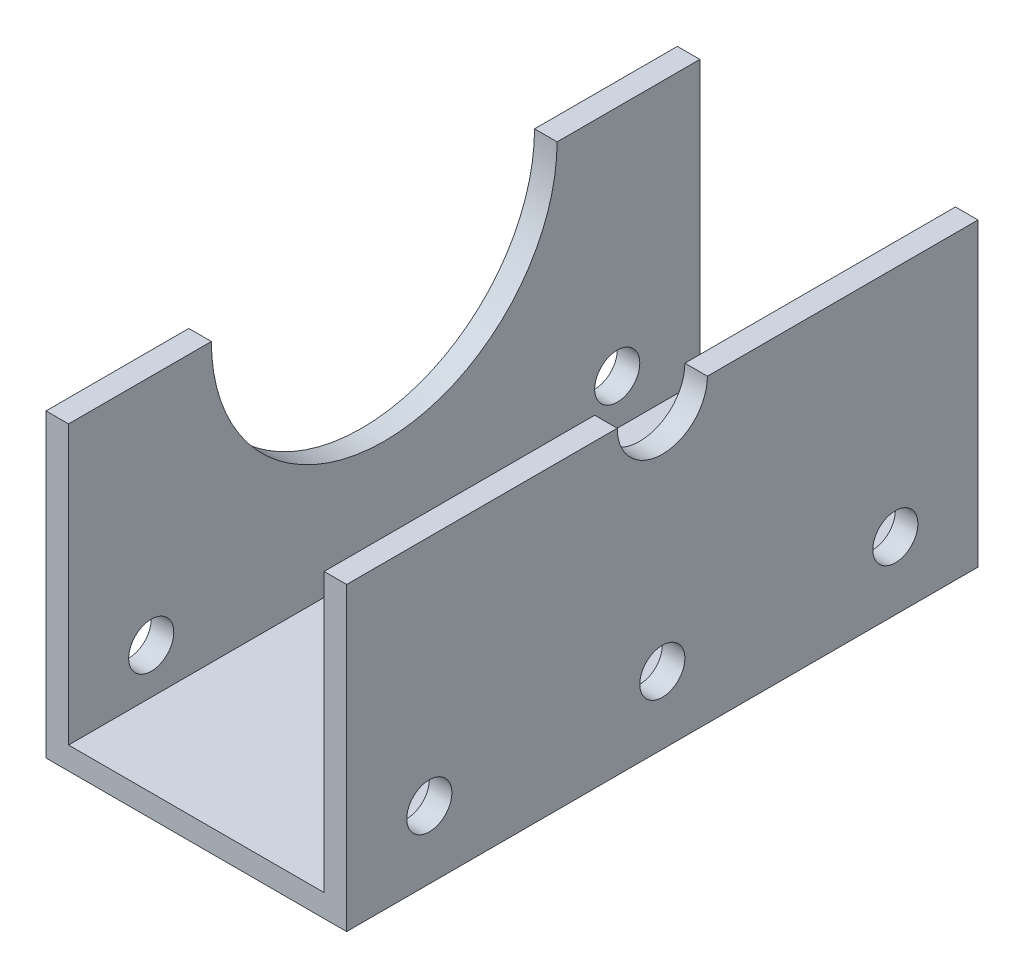
ISO-10303-21;
HEADER;
FILE_DESCRIPTION(('STEP AP214'),'2;1');
FILE_NAME('part.step','',(''),(''),'','','');
FILE_SCHEMA(('AUTOMOTIVE_DESIGN { 1 0 10303 214 1 1 1 1 }'));
ENDSEC;
DATA;
#1=APPLICATION_CONTEXT('core data for automotive mechanical design processes');
#2=APPLICATION_PROTOCOL_DEFINITION('international standard','automotive_design',2000,#1);
#3=PRODUCT_CONTEXT('',#1,'mechanical');
#4=PRODUCT('Part','Part','',(#3));
#5=PRODUCT_RELATED_PRODUCT_CATEGORY('part','',(#4));
#6=PRODUCT_DEFINITION_FORMATION('','',#4);
#7=PRODUCT_DEFINITION_CONTEXT('part definition',#1,'design');
#8=PRODUCT_DEFINITION('design','',#6,#7);
#9=PRODUCT_DEFINITION_SHAPE('','',#8);
#10=(LENGTH_UNIT() NAMED_UNIT(*) SI_UNIT(.MILLI.,.METRE.));
#11=(NAMED_UNIT(*) PLANE_ANGLE_UNIT() SI_UNIT($,.RADIAN.));
#12=(NAMED_UNIT(*) SI_UNIT($,.STERADIAN.) SOLID_ANGLE_UNIT());
#13=UNCERTAINTY_MEASURE_WITH_UNIT(LENGTH_MEASURE(1.E-05),#10,'distance_accuracy_value','');
#14=(GEOMETRIC_REPRESENTATION_CONTEXT(3) GLOBAL_UNCERTAINTY_ASSIGNED_CONTEXT((#13)) GLOBAL_UNIT_ASSIGNED_CONTEXT((#10,
#11,#12)) REPRESENTATION_CONTEXT('',''));
#15=CARTESIAN_POINT('',(0.,0.,0.));
#16=DIRECTION('',(0.,0.,1.));
#17=DIRECTION('',(1.,0.,0.));
#18=AXIS2_PLACEMENT_3D('',#15,#16,#17);
#19=CARTESIAN_POINT('',(4.38641888332215,13.1812631578947,42.));
#20=DIRECTION('',(0.,-1.,0.));
#21=DIRECTION('',(0.,0.,-1.));
#22=AXIS2_PLACEMENT_3D('',#19,#20,#21);
#23=PLANE('',#22);
#24=DIRECTION('',(0.,0.,-1.));
#25=VECTOR('',#24,1.);
#26=CARTESIAN_POINT('',(2.88641888332215,13.1812631578947,42.));
#27=LINE('',#26,#25);
#28=CARTESIAN_POINT('',(2.88641888332215,13.1812631578947,18.));
#29=VERTEX_POINT('',#28);
#30=CARTESIAN_POINT('',(2.88641888332215,13.1812631578947,0.));
#31=VERTEX_POINT('',#30);
#32=EDGE_CURVE('E130',#29,#31,#27,.T.);
#33=ORIENTED_EDGE('',*,*,#32,.F.);
#34=DIRECTION('',(1.,0.,0.));
#35=VECTOR('',#34,1.);
#36=CARTESIAN_POINT('',(-5.61358111667785,13.1812631578947,18.));
#37=LINE('',#36,#35);
#38=CARTESIAN_POINT('',(4.38641888332215,13.1812631578947,18.));
#39=VERTEX_POINT('',#38);
#40=EDGE_CURVE('E45',#29,#39,#37,.T.);
#41=ORIENTED_EDGE('',*,*,#40,.T.);
#42=DIRECTION('',(0.,0.,-1.));
#43=VECTOR('',#42,1.);
#44=CARTESIAN_POINT('',(4.38641888332215,13.1812631578947,42.));
#45=LINE('',#44,#43);
#46=CARTESIAN_POINT('',(4.38641888332215,13.1812631578947,0.));
#47=VERTEX_POINT('',#46);
#48=EDGE_CURVE('E128',#39,#47,#45,.T.);
#49=ORIENTED_EDGE('',*,*,#48,.T.);
#50=DIRECTION('',(-1.,0.,0.));
#51=VECTOR('',#50,1.);
#52=CARTESIAN_POINT('',(4.38641888332215,13.1812631578947,0.));
#53=LINE('',#52,#51);
#54=EDGE_CURVE('E202',#47,#31,#53,.T.);
#55=ORIENTED_EDGE('',*,*,#54,.T.);
#56=EDGE_LOOP('',(#33,#41,#49,#55));
#57=FACE_BOUND('',#56,.T.);
#58=ADVANCED_FACE('F30',(#57),#23,.F.);
#59=CARTESIAN_POINT('',(-14.1135811166779,13.1812631578947,42.));
#60=DIRECTION('',(0.,-1.,0.));
#61=DIRECTION('',(0.,0.,-1.));
#62=AXIS2_PLACEMENT_3D('',#59,#60,#61);
#63=PLANE('',#62);
#64=DIRECTION('',(0.,0.,-1.));
#65=VECTOR('',#64,1.);
#66=CARTESIAN_POINT('',(-14.1135811166779,13.1812631578947,42.));
#67=LINE('',#66,#65);
#68=CARTESIAN_POINT('',(-14.1135811166779,13.1812631578947,42.));
#69=VERTEX_POINT('',#68);
#70=CARTESIAN_POINT('',(-14.1135811166779,13.1812631578947,32.5));
#71=VERTEX_POINT('',#70);
#72=EDGE_CURVE('E174',#69,#71,#67,.T.);
#73=ORIENTED_EDGE('',*,*,#72,.T.);
#74=DIRECTION('',(-1.,0.,0.));
#75=VECTOR('',#74,1.);
#76=CARTESIAN_POINT('',(-5.61358111667785,13.1812631578947,32.5));
#77=LINE('',#76,#75);
#78=CARTESIAN_POINT('',(-15.6135811166778,13.1812631578947,32.5));
#79=VERTEX_POINT('',#78);
#80=EDGE_CURVE('E52',#71,#79,#77,.T.);
#81=ORIENTED_EDGE('',*,*,#80,.T.);
#82=DIRECTION('',(0.,0.,-1.));
#83=VECTOR('',#82,1.);
#84=CARTESIAN_POINT('',(-15.6135811166778,13.1812631578947,42.));
#85=LINE('',#84,#83);
#86=CARTESIAN_POINT('',(-15.6135811166778,13.1812631578947,42.));
#87=VERTEX_POINT('',#86);
#88=EDGE_CURVE('E151',#87,#79,#85,.T.);
#89=ORIENTED_EDGE('',*,*,#88,.F.);
#90=DIRECTION('',(-1.,0.,0.));
#91=VECTOR('',#90,1.);
#92=CARTESIAN_POINT('',(-14.1135811166779,13.1812631578947,42.));
#93=LINE('',#92,#91);
#94=EDGE_CURVE('E183',#69,#87,#93,.T.);
#95=ORIENTED_EDGE('',*,*,#94,.F.);
#96=EDGE_LOOP('',(#73,#81,#89,#95));
#97=FACE_BOUND('',#96,.T.);
#98=ADVANCED_FACE('F180',(#97),#63,.F.);
#99=CARTESIAN_POINT('',(-15.6135811166778,13.1812631578947,9.49999999999999));
#100=VERTEX_POINT('',#99);
#101=CARTESIAN_POINT('',(-15.6135811166778,13.1812631578947,0.));
#102=VERTEX_POINT('',#101);
#103=EDGE_CURVE('E150',#100,#102,#85,.T.);
#104=ORIENTED_EDGE('',*,*,#103,.F.);
#105=DIRECTION('',(-1.,0.,0.));
#106=VECTOR('',#105,1.);
#107=CARTESIAN_POINT('',(-5.61358111667785,13.1812631578947,9.49999999999999));
#108=LINE('',#107,#106);
#109=CARTESIAN_POINT('',(-14.1135811166779,13.1812631578947,9.49999999999999));
#110=VERTEX_POINT('',#109);
#111=EDGE_CURVE('E249',#100,#110,#108,.F.);
#112=ORIENTED_EDGE('',*,*,#111,.T.);
#113=CARTESIAN_POINT('',(-14.1135811166779,13.1812631578947,0.));
#114=VERTEX_POINT('',#113);
#115=EDGE_CURVE('E177',#110,#114,#67,.T.);
#116=ORIENTED_EDGE('',*,*,#115,.T.);
#117=DIRECTION('',(-1.,0.,0.));
#118=VECTOR('',#117,1.);
#119=CARTESIAN_POINT('',(-14.1135811166779,13.1812631578947,0.));
#120=LINE('',#119,#118);
#121=EDGE_CURVE('E216',#114,#102,#120,.T.);
#122=ORIENTED_EDGE('',*,*,#121,.T.);
#123=EDGE_LOOP('',(#104,#112,#116,#122));
#124=FACE_BOUND('',#123,.T.);
#125=ADVANCED_FACE('F32',(#124),#63,.F.);
#126=CARTESIAN_POINT('',(-15.6135811166778,13.1812631578947,42.));
#127=DIRECTION('',(1.,0.,0.));
#128=DIRECTION('',(0.,1.,0.));
#129=AXIS2_PLACEMENT_3D('',#126,#127,#128);
#130=PLANE('',#129);
#131=CARTESIAN_POINT('',(-15.6135811166779,-2.31873684210526,5.5));
#132=DIRECTION('',(1.,0.,0.));
#133=DIRECTION('',(0.,0.,-1.));
#134=AXIS2_PLACEMENT_3D('',#131,#132,#133);
#135=CIRCLE('',#134,1.5);
#136=CARTESIAN_POINT('',(-15.6135811166779,-2.31873684210526,4.));
#137=VERTEX_POINT('',#136);
#138=EDGE_CURVE('E163',#137,#137,#135,.T.);
#139=ORIENTED_EDGE('',*,*,#138,.T.);
#140=EDGE_LOOP('',(#139));
#141=FACE_BOUND('',#140,.T.);
#142=CARTESIAN_POINT('',(-15.6135811166779,-2.31873684210526,36.5));
#143=DIRECTION('',(1.,0.,0.));
#144=DIRECTION('',(0.,0.,-1.));
#145=AXIS2_PLACEMENT_3D('',#142,#143,#144);
#146=CIRCLE('',#145,1.5);
#147=CARTESIAN_POINT('',(-15.6135811166779,-2.31873684210526,35.));
#148=VERTEX_POINT('',#147);
#149=EDGE_CURVE('E158',#148,#148,#146,.T.);
#150=ORIENTED_EDGE('',*,*,#149,.T.);
#151=EDGE_LOOP('',(#150));
#152=FACE_BOUND('',#151,.T.);
#153=ORIENTED_EDGE('',*,*,#88,.T.);
#154=CARTESIAN_POINT('',(-15.6135811166778,13.1812631578947,21.));
#155=DIRECTION('',(-1.,0.,0.));
#156=DIRECTION('',(0.,-1.,0.));
#157=AXIS2_PLACEMENT_3D('',#154,#155,#156);
#158=CIRCLE('',#157,11.5);
#159=EDGE_CURVE('E131',#100,#79,#158,.T.);
#160=ORIENTED_EDGE('',*,*,#159,.F.);
#161=ORIENTED_EDGE('',*,*,#103,.T.);
#162=DIRECTION('',(0.,-1.,0.));
#163=VECTOR('',#162,1.);
#164=CARTESIAN_POINT('',(-15.6135811166778,13.1812631578947,0.));
#165=LINE('',#164,#163);
#166=CARTESIAN_POINT('',(-15.6135811166778,-6.81873684210526,0.));
#167=VERTEX_POINT('',#166);
#168=EDGE_CURVE('E214',#102,#167,#165,.T.);
#169=ORIENTED_EDGE('',*,*,#168,.T.);
#170=DIRECTION('',(0.,0.,-1.));
#171=VECTOR('',#170,1.);
#172=CARTESIAN_POINT('',(-15.6135811166778,-6.81873684210526,42.));
#173=LINE('',#172,#171);
#174=CARTESIAN_POINT('',(-15.6135811166778,-6.81873684210526,42.));
#175=VERTEX_POINT('',#174);
#176=EDGE_CURVE('E147',#175,#167,#173,.T.);
#177=ORIENTED_EDGE('',*,*,#176,.F.);
#178=DIRECTION('',(0.,-1.,0.));
#179=VECTOR('',#178,1.);
#180=CARTESIAN_POINT('',(-15.6135811166778,13.1812631578947,42.));
#181=LINE('',#180,#179);
#182=EDGE_CURVE('E230',#87,#175,#181,.T.);
#183=ORIENTED_EDGE('',*,*,#182,.F.);
#184=EDGE_LOOP('',(#153,#160,#161,#169,#177,#183));
#185=FACE_BOUND('',#184,.T.);
#186=ADVANCED_FACE('F269',(#141,#152,#185),#130,.F.);
#187=CARTESIAN_POINT('',(-15.6135811166778,-6.81873684210526,42.));
#188=DIRECTION('',(0.,1.,0.));
#189=DIRECTION('',(0.,0.,1.));
#190=AXIS2_PLACEMENT_3D('',#187,#188,#189);
#191=PLANE('',#190);
#192=DIRECTION('',(1.,0.,0.));
#193=VECTOR('',#192,1.);
#194=CARTESIAN_POINT('',(-15.6135811166778,-6.81873684210526,0.));
#195=LINE('',#194,#193);
#196=CARTESIAN_POINT('',(4.38641888332215,-6.81873684210526,0.));
#197=VERTEX_POINT('',#196);
#198=EDGE_CURVE('E212',#167,#197,#195,.T.);
#199=ORIENTED_EDGE('',*,*,#198,.T.);
#200=DIRECTION('',(0.,0.,-1.));
#201=VECTOR('',#200,1.);
#202=CARTESIAN_POINT('',(4.38641888332215,-6.81873684210526,42.));
#203=LINE('',#202,#201);
#204=CARTESIAN_POINT('',(4.38641888332215,-6.81873684210526,42.));
#205=VERTEX_POINT('',#204);
#206=EDGE_CURVE('E141',#205,#197,#203,.T.);
#207=ORIENTED_EDGE('',*,*,#206,.F.);
#208=DIRECTION('',(1.,0.,0.));
#209=VECTOR('',#208,1.);
#210=CARTESIAN_POINT('',(-15.6135811166778,-6.81873684210526,42.));
#211=LINE('',#210,#209);
#212=EDGE_CURVE('E228',#175,#205,#211,.T.);
#213=ORIENTED_EDGE('',*,*,#212,.F.);
#214=ORIENTED_EDGE('',*,*,#176,.T.);
#215=EDGE_LOOP('',(#199,#207,#213,#214));
#216=FACE_BOUND('',#215,.T.);
#217=ADVANCED_FACE('F266',(#216),#191,.F.);
#218=CARTESIAN_POINT('',(4.38641888332215,-6.81873684210526,42.));
#219=DIRECTION('',(-1.,0.,0.));
#220=DIRECTION('',(0.,0.,1.));
#221=AXIS2_PLACEMENT_3D('',#218,#219,#220);
#222=PLANE('',#221);
#223=CARTESIAN_POINT('',(4.38641888332215,-2.31873684210526,21.));
#224=DIRECTION('',(1.,0.,0.));
#225=DIRECTION('',(0.,0.,-1.));
#226=AXIS2_PLACEMENT_3D('',#223,#224,#225);
#227=CIRCLE('',#226,1.5);
#228=CARTESIAN_POINT('',(4.38641888332215,-2.31873684210526,19.5));
#229=VERTEX_POINT('',#228);
#230=EDGE_CURVE('E167',#229,#229,#227,.T.);
#231=ORIENTED_EDGE('',*,*,#230,.F.);
#232=EDGE_LOOP('',(#231));
#233=FACE_BOUND('',#232,.T.);
#234=CARTESIAN_POINT('',(4.38641888332215,-2.31873684210526,5.5));
#235=DIRECTION('',(1.,0.,0.));
#236=DIRECTION('',(0.,0.,-1.));
#237=AXIS2_PLACEMENT_3D('',#234,#235,#236);
#238=CIRCLE('',#237,1.5);
#239=CARTESIAN_POINT('',(4.38641888332215,-2.31873684210526,4.));
#240=VERTEX_POINT('',#239);
#241=EDGE_CURVE('E166',#240,#240,#238,.T.);
#242=ORIENTED_EDGE('',*,*,#241,.F.);
#243=EDGE_LOOP('',(#242));
#244=FACE_BOUND('',#243,.T.);
#245=CARTESIAN_POINT('',(4.38641888332215,-2.31873684210526,36.5));
#246=DIRECTION('',(1.,0.,0.));
#247=DIRECTION('',(0.,0.,-1.));
#248=AXIS2_PLACEMENT_3D('',#245,#246,#247);
#249=CIRCLE('',#248,1.5);
#250=CARTESIAN_POINT('',(4.38641888332215,-2.31873684210526,35.));
#251=VERTEX_POINT('',#250);
#252=EDGE_CURVE('E235',#251,#251,#249,.T.);
#253=ORIENTED_EDGE('',*,*,#252,.F.);
#254=EDGE_LOOP('',(#253));
#255=FACE_BOUND('',#254,.T.);
#256=ORIENTED_EDGE('',*,*,#48,.F.);
#257=CARTESIAN_POINT('',(4.38641888332215,13.1812631578947,21.));
#258=DIRECTION('',(1.,0.,0.));
#259=DIRECTION('',(0.,0.,-1.));
#260=AXIS2_PLACEMENT_3D('',#257,#258,#259);
#261=CIRCLE('',#260,3.);
#262=CARTESIAN_POINT('',(4.38641888332215,13.1812631578947,24.));
#263=VERTEX_POINT('',#262);
#264=EDGE_CURVE('E116',#263,#39,#261,.T.);
#265=ORIENTED_EDGE('',*,*,#264,.F.);
#266=CARTESIAN_POINT('',(4.38641888332215,13.1812631578947,42.));
#267=VERTEX_POINT('',#266);
#268=EDGE_CURVE('E138',#267,#263,#45,.T.);
#269=ORIENTED_EDGE('',*,*,#268,.F.);
#270=DIRECTION('',(0.,1.,0.));
#271=VECTOR('',#270,1.);
#272=CARTESIAN_POINT('',(4.38641888332215,-6.81873684210526,42.));
#273=LINE('',#272,#271);
#274=EDGE_CURVE('E226',#205,#267,#273,.T.);
#275=ORIENTED_EDGE('',*,*,#274,.F.);
#276=ORIENTED_EDGE('',*,*,#206,.T.);
#277=DIRECTION('',(0.,1.,0.));
#278=VECTOR('',#277,1.);
#279=CARTESIAN_POINT('',(4.38641888332215,-6.81873684210526,0.));
#280=LINE('',#279,#278);
#281=EDGE_CURVE('E136',#197,#47,#280,.T.);
#282=ORIENTED_EDGE('',*,*,#281,.T.);
#283=EDGE_LOOP('',(#256,#265,#269,#275,#276,#282));
#284=FACE_BOUND('',#283,.T.);
#285=ADVANCED_FACE('F133',(#233,#244,#255,#284),#222,.F.);
#286=ORIENTED_EDGE('',*,*,#268,.T.);
#287=DIRECTION('',(1.,0.,0.));
#288=VECTOR('',#287,1.);
#289=CARTESIAN_POINT('',(-5.61358111667785,13.1812631578947,24.));
#290=LINE('',#289,#288);
#291=CARTESIAN_POINT('',(2.88641888332215,13.1812631578947,24.));
#292=VERTEX_POINT('',#291);
#293=EDGE_CURVE('E119',#263,#292,#290,.F.);
#294=ORIENTED_EDGE('',*,*,#293,.T.);
#295=CARTESIAN_POINT('',(2.88641888332215,13.1812631578947,42.));
#296=VERTEX_POINT('',#295);
#297=EDGE_CURVE('E139',#296,#292,#27,.T.);
#298=ORIENTED_EDGE('',*,*,#297,.F.);
#299=DIRECTION('',(-1.,0.,0.));
#300=VECTOR('',#299,1.);
#301=CARTESIAN_POINT('',(4.38641888332215,13.1812631578947,42.));
#302=LINE('',#301,#300);
#303=EDGE_CURVE('E224',#267,#296,#302,.T.);
#304=ORIENTED_EDGE('',*,*,#303,.F.);
#305=EDGE_LOOP('',(#286,#294,#298,#304));
#306=FACE_BOUND('',#305,.T.);
#307=ADVANCED_FACE('F254',(#306),#23,.F.);
#308=CARTESIAN_POINT('',(2.88641888332215,13.1812631578947,42.));
#309=DIRECTION('',(1.,0.,0.));
#310=DIRECTION('',(0.,1.,0.));
#311=AXIS2_PLACEMENT_3D('',#308,#309,#310);
#312=PLANE('',#311);
#313=CARTESIAN_POINT('',(2.88641888332215,-2.31873684210526,21.));
#314=DIRECTION('',(1.,0.,0.));
#315=DIRECTION('',(0.,1.,0.));
#316=AXIS2_PLACEMENT_3D('',#313,#314,#315);
#317=CIRCLE('',#316,1.5);
#318=CARTESIAN_POINT('',(2.88641888332215,-0.818736842105263,21.));
#319=VERTEX_POINT('',#318);
#320=EDGE_CURVE('E164',#319,#319,#317,.T.);
#321=ORIENTED_EDGE('',*,*,#320,.T.);
#322=EDGE_LOOP('',(#321));
#323=FACE_BOUND('',#322,.T.);
#324=CARTESIAN_POINT('',(2.88641888332215,-2.31873684210526,5.5));
#325=DIRECTION('',(1.,0.,0.));
#326=DIRECTION('',(0.,1.,0.));
#327=AXIS2_PLACEMENT_3D('',#324,#325,#326);
#328=CIRCLE('',#327,1.5);
#329=CARTESIAN_POINT('',(2.88641888332215,-0.818736842105263,5.5));
#330=VERTEX_POINT('',#329);
#331=EDGE_CURVE('E162',#330,#330,#328,.T.);
#332=ORIENTED_EDGE('',*,*,#331,.T.);
#333=EDGE_LOOP('',(#332));
#334=FACE_BOUND('',#333,.T.);
#335=CARTESIAN_POINT('',(2.88641888332215,-2.31873684210526,36.5));
#336=DIRECTION('',(1.,0.,0.));
#337=DIRECTION('',(0.,1.,0.));
#338=AXIS2_PLACEMENT_3D('',#335,#336,#337);
#339=CIRCLE('',#338,1.5);
#340=CARTESIAN_POINT('',(2.88641888332215,-0.818736842105259,36.5));
#341=VERTEX_POINT('',#340);
#342=EDGE_CURVE('E157',#341,#341,#339,.T.);
#343=ORIENTED_EDGE('',*,*,#342,.T.);
#344=EDGE_LOOP('',(#343));
#345=FACE_BOUND('',#344,.T.);
#346=ORIENTED_EDGE('',*,*,#297,.T.);
#347=CARTESIAN_POINT('',(2.88641888332215,13.1812631578947,21.));
#348=DIRECTION('',(1.,0.,0.));
#349=DIRECTION('',(0.,1.,0.));
#350=AXIS2_PLACEMENT_3D('',#347,#348,#349);
#351=CIRCLE('',#350,3.);
#352=EDGE_CURVE('E11',#292,#29,#351,.T.);
#353=ORIENTED_EDGE('',*,*,#352,.T.);
#354=ORIENTED_EDGE('',*,*,#32,.T.);
#355=DIRECTION('',(0.,-1.,0.));
#356=VECTOR('',#355,1.);
#357=CARTESIAN_POINT('',(2.88641888332215,13.1812631578947,0.));
#358=LINE('',#357,#356);
#359=CARTESIAN_POINT('',(2.88641888332216,-5.31873684210526,0.));
#360=VERTEX_POINT('',#359);
#361=EDGE_CURVE('E201',#31,#360,#358,.T.);
#362=ORIENTED_EDGE('',*,*,#361,.T.);
#363=DIRECTION('',(0.,0.,-1.));
#364=VECTOR('',#363,1.);
#365=CARTESIAN_POINT('',(2.88641888332216,-5.31873684210526,42.));
#366=LINE('',#365,#364);
#367=CARTESIAN_POINT('',(2.88641888332216,-5.31873684210526,42.));
#368=VERTEX_POINT('',#367);
#369=EDGE_CURVE('E187',#368,#360,#366,.T.);
#370=ORIENTED_EDGE('',*,*,#369,.F.);
#371=DIRECTION('',(0.,-1.,0.));
#372=VECTOR('',#371,1.);
#373=CARTESIAN_POINT('',(2.88641888332215,13.1812631578947,42.));
#374=LINE('',#373,#372);
#375=EDGE_CURVE('E222',#296,#368,#374,.T.);
#376=ORIENTED_EDGE('',*,*,#375,.F.);
#377=EDGE_LOOP('',(#346,#353,#354,#362,#370,#376));
#378=FACE_BOUND('',#377,.T.);
#379=ADVANCED_FACE('F199',(#323,#334,#345,#378),#312,.F.);
#380=CARTESIAN_POINT('',(2.88641888332216,-5.31873684210526,42.));
#381=DIRECTION('',(0.,-1.,0.));
#382=DIRECTION('',(1.,0.,0.));
#383=AXIS2_PLACEMENT_3D('',#380,#381,#382);
#384=PLANE('',#383);
#385=DIRECTION('',(-1.,0.,0.));
#386=VECTOR('',#385,1.);
#387=CARTESIAN_POINT('',(2.88641888332216,-5.31873684210526,0.));
#388=LINE('',#387,#386);
#389=CARTESIAN_POINT('',(-14.1135811166778,-5.31873684210526,0.));
#390=VERTEX_POINT('',#389);
#391=EDGE_CURVE('E208',#360,#390,#388,.T.);
#392=ORIENTED_EDGE('',*,*,#391,.T.);
#393=DIRECTION('',(0.,0.,-1.));
#394=VECTOR('',#393,1.);
#395=CARTESIAN_POINT('',(-14.1135811166778,-5.31873684210526,42.));
#396=LINE('',#395,#394);
#397=CARTESIAN_POINT('',(-14.1135811166778,-5.31873684210526,42.));
#398=VERTEX_POINT('',#397);
#399=EDGE_CURVE('E184',#398,#390,#396,.T.);
#400=ORIENTED_EDGE('',*,*,#399,.F.);
#401=DIRECTION('',(-1.,0.,0.));
#402=VECTOR('',#401,1.);
#403=CARTESIAN_POINT('',(2.88641888332216,-5.31873684210526,42.));
#404=LINE('',#403,#402);
#405=EDGE_CURVE('E220',#368,#398,#404,.T.);
#406=ORIENTED_EDGE('',*,*,#405,.F.);
#407=ORIENTED_EDGE('',*,*,#369,.T.);
#408=EDGE_LOOP('',(#392,#400,#406,#407));
#409=FACE_BOUND('',#408,.T.);
#410=ADVANCED_FACE('F273',(#409),#384,.F.);
#411=CARTESIAN_POINT('',(-14.1135811166778,-5.31873684210526,42.));
#412=DIRECTION('',(-1.,0.,0.));
#413=DIRECTION('',(0.,-1.,0.));
#414=AXIS2_PLACEMENT_3D('',#411,#412,#413);
#415=PLANE('',#414);
#416=CARTESIAN_POINT('',(-14.1135811166778,-2.31873684210526,5.5));
#417=DIRECTION('',(-1.,0.,0.));
#418=DIRECTION('',(0.,-1.,0.));
#419=AXIS2_PLACEMENT_3D('',#416,#417,#418);
#420=CIRCLE('',#419,1.5);
#421=CARTESIAN_POINT('',(-14.1135811166778,-3.81873684210526,5.5));
#422=VERTEX_POINT('',#421);
#423=EDGE_CURVE('E159',#422,#422,#420,.T.);
#424=ORIENTED_EDGE('',*,*,#423,.T.);
#425=EDGE_LOOP('',(#424));
#426=FACE_BOUND('',#425,.T.);
#427=CARTESIAN_POINT('',(-14.1135811166778,-2.31873684210526,36.5));
#428=DIRECTION('',(-1.,0.,0.));
#429=DIRECTION('',(0.,-1.,0.));
#430=AXIS2_PLACEMENT_3D('',#427,#428,#429);
#431=CIRCLE('',#430,1.5);
#432=CARTESIAN_POINT('',(-14.1135811166778,-3.81873684210527,36.5));
#433=VERTEX_POINT('',#432);
#434=EDGE_CURVE('E154',#433,#433,#431,.T.);
#435=ORIENTED_EDGE('',*,*,#434,.T.);
#436=EDGE_LOOP('',(#435));
#437=FACE_BOUND('',#436,.T.);
#438=ORIENTED_EDGE('',*,*,#115,.F.);
#439=CARTESIAN_POINT('',(-14.1135811166779,13.1812631578947,21.));
#440=DIRECTION('',(-1.,0.,0.));
#441=DIRECTION('',(0.,-1.,0.));
#442=AXIS2_PLACEMENT_3D('',#439,#440,#441);
#443=CIRCLE('',#442,11.5);
#444=EDGE_CURVE('E38',#110,#71,#443,.T.);
#445=ORIENTED_EDGE('',*,*,#444,.T.);
#446=ORIENTED_EDGE('',*,*,#72,.F.);
#447=DIRECTION('',(0.,1.,0.));
#448=VECTOR('',#447,1.);
#449=CARTESIAN_POINT('',(-14.1135811166778,-5.31873684210526,42.));
#450=LINE('',#449,#448);
#451=EDGE_CURVE('E189',#398,#69,#450,.T.);
#452=ORIENTED_EDGE('',*,*,#451,.F.);
#453=ORIENTED_EDGE('',*,*,#399,.T.);
#454=DIRECTION('',(0.,1.,0.));
#455=VECTOR('',#454,1.);
#456=CARTESIAN_POINT('',(-14.1135811166778,-5.31873684210526,0.));
#457=LINE('',#456,#455);
#458=EDGE_CURVE('E191',#390,#114,#457,.T.);
#459=ORIENTED_EDGE('',*,*,#458,.T.);
#460=EDGE_LOOP('',(#438,#445,#446,#452,#453,#459));
#461=FACE_BOUND('',#460,.T.);
#462=ADVANCED_FACE('F172',(#426,#437,#461),#415,.F.);
#463=CARTESIAN_POINT('',(-15.6135811166778,13.1812631578947,42.));
#464=DIRECTION('',(0.,0.,1.));
#465=DIRECTION('',(1.,0.,0.));
#466=AXIS2_PLACEMENT_3D('',#463,#464,#465);
#467=PLANE('',#466);
#468=ORIENTED_EDGE('',*,*,#94,.T.);
#469=ORIENTED_EDGE('',*,*,#182,.T.);
#470=ORIENTED_EDGE('',*,*,#212,.T.);
#471=ORIENTED_EDGE('',*,*,#274,.T.);
#472=ORIENTED_EDGE('',*,*,#303,.T.);
#473=ORIENTED_EDGE('',*,*,#375,.T.);
#474=ORIENTED_EDGE('',*,*,#405,.T.);
#475=ORIENTED_EDGE('',*,*,#451,.T.);
#476=EDGE_LOOP('',(#468,#469,#470,#471,#472,#473,#474,#475));
#477=FACE_BOUND('',#476,.T.);
#478=ADVANCED_FACE('F258',(#477),#467,.T.);
#479=CARTESIAN_POINT('',(-15.6135811166778,13.1812631578947,0.));
#480=DIRECTION('',(0.,0.,1.));
#481=DIRECTION('',(1.,0.,0.));
#482=AXIS2_PLACEMENT_3D('',#479,#480,#481);
#483=PLANE('',#482);
#484=ORIENTED_EDGE('',*,*,#121,.F.);
#485=ORIENTED_EDGE('',*,*,#458,.F.);
#486=ORIENTED_EDGE('',*,*,#391,.F.);
#487=ORIENTED_EDGE('',*,*,#361,.F.);
#488=ORIENTED_EDGE('',*,*,#54,.F.);
#489=ORIENTED_EDGE('',*,*,#281,.F.);
#490=ORIENTED_EDGE('',*,*,#198,.F.);
#491=ORIENTED_EDGE('',*,*,#168,.F.);
#492=EDGE_LOOP('',(#484,#485,#486,#487,#488,#489,#490,#491));
#493=FACE_BOUND('',#492,.T.);
#494=ADVANCED_FACE('F206',(#493),#483,.F.);
#495=CARTESIAN_POINT('',(-15.6135811166779,-2.31873684210526,36.5));
#496=DIRECTION('',(1.,0.,0.));
#497=DIRECTION('',(0.,0.,-1.));
#498=AXIS2_PLACEMENT_3D('',#495,#496,#497);
#499=CYLINDRICAL_SURFACE('',#498,1.5);
#500=ORIENTED_EDGE('',*,*,#149,.F.);
#501=EDGE_LOOP('',(#500));
#502=FACE_BOUND('',#501,.T.);
#503=ORIENTED_EDGE('',*,*,#434,.F.);
#504=EDGE_LOOP('',(#503));
#505=FACE_BOUND('',#504,.T.);
#506=ADVANCED_FACE('F310',(#502,#505),#499,.F.);
#507=ORIENTED_EDGE('',*,*,#252,.T.);
#508=EDGE_LOOP('',(#507));
#509=FACE_BOUND('',#508,.T.);
#510=ORIENTED_EDGE('',*,*,#342,.F.);
#511=EDGE_LOOP('',(#510));
#512=FACE_BOUND('',#511,.T.);
#513=ADVANCED_FACE('F313',(#509,#512),#499,.F.);
#514=CARTESIAN_POINT('',(-15.6135811166779,-2.31873684210526,5.5));
#515=DIRECTION('',(1.,0.,0.));
#516=DIRECTION('',(0.,0.,-1.));
#517=AXIS2_PLACEMENT_3D('',#514,#515,#516);
#518=CYLINDRICAL_SURFACE('',#517,1.5);
#519=ORIENTED_EDGE('',*,*,#138,.F.);
#520=EDGE_LOOP('',(#519));
#521=FACE_BOUND('',#520,.T.);
#522=ORIENTED_EDGE('',*,*,#423,.F.);
#523=EDGE_LOOP('',(#522));
#524=FACE_BOUND('',#523,.T.);
#525=ADVANCED_FACE('F321',(#521,#524),#518,.F.);
#526=ORIENTED_EDGE('',*,*,#241,.T.);
#527=EDGE_LOOP('',(#526));
#528=FACE_BOUND('',#527,.T.);
#529=ORIENTED_EDGE('',*,*,#331,.F.);
#530=EDGE_LOOP('',(#529));
#531=FACE_BOUND('',#530,.T.);
#532=ADVANCED_FACE('F326',(#528,#531),#518,.F.);
#533=CARTESIAN_POINT('',(-5.61358111667785,-2.31873684210526,21.));
#534=DIRECTION('',(1.,0.,0.));
#535=DIRECTION('',(0.,0.,-1.));
#536=AXIS2_PLACEMENT_3D('',#533,#534,#535);
#537=CYLINDRICAL_SURFACE('',#536,1.5);
#538=ORIENTED_EDGE('',*,*,#230,.T.);
#539=EDGE_LOOP('',(#538));
#540=FACE_BOUND('',#539,.T.);
#541=ORIENTED_EDGE('',*,*,#320,.F.);
#542=EDGE_LOOP('',(#541));
#543=FACE_BOUND('',#542,.T.);
#544=ADVANCED_FACE('F364',(#540,#543),#537,.F.);
#545=CARTESIAN_POINT('',(-5.61358111667785,13.1812631578947,21.));
#546=DIRECTION('',(-1.,0.,0.));
#547=DIRECTION('',(0.,-1.,0.));
#548=AXIS2_PLACEMENT_3D('',#545,#546,#547);
#549=CYLINDRICAL_SURFACE('',#548,11.5);
#550=ORIENTED_EDGE('',*,*,#444,.F.);
#551=ORIENTED_EDGE('',*,*,#111,.F.);
#552=ORIENTED_EDGE('',*,*,#159,.T.);
#553=ORIENTED_EDGE('',*,*,#80,.F.);
#554=EDGE_LOOP('',(#550,#551,#552,#553));
#555=FACE_BOUND('',#554,.T.);
#556=ADVANCED_FACE('F373',(#555),#549,.F.);
#557=CARTESIAN_POINT('',(-5.61358111667785,13.1812631578947,21.));
#558=DIRECTION('',(1.,0.,0.));
#559=DIRECTION('',(0.,0.,-1.));
#560=AXIS2_PLACEMENT_3D('',#557,#558,#559);
#561=CYLINDRICAL_SURFACE('',#560,3.);
#562=ORIENTED_EDGE('',*,*,#352,.F.);
#563=ORIENTED_EDGE('',*,*,#293,.F.);
#564=ORIENTED_EDGE('',*,*,#264,.T.);
#565=ORIENTED_EDGE('',*,*,#40,.F.);
#566=EDGE_LOOP('',(#562,#563,#564,#565));
#567=FACE_BOUND('',#566,.T.);
#568=ADVANCED_FACE('F117',(#567),#561,.F.);
#569=CLOSED_SHELL('',(#58,#98,#125,#186,#217,#285,#307,#379,#410,#462,#478,#494,#506,#513,#525,
#532,#544,#556,#568));
#570=MANIFOLD_SOLID_BREP('B2',#569);
#571=ADVANCED_BREP_SHAPE_REPRESENTATION('',(#18,#570),#14);
#572=SHAPE_DEFINITION_REPRESENTATION(#9,#571);
ENDSEC;
END-ISO-10303-21;
